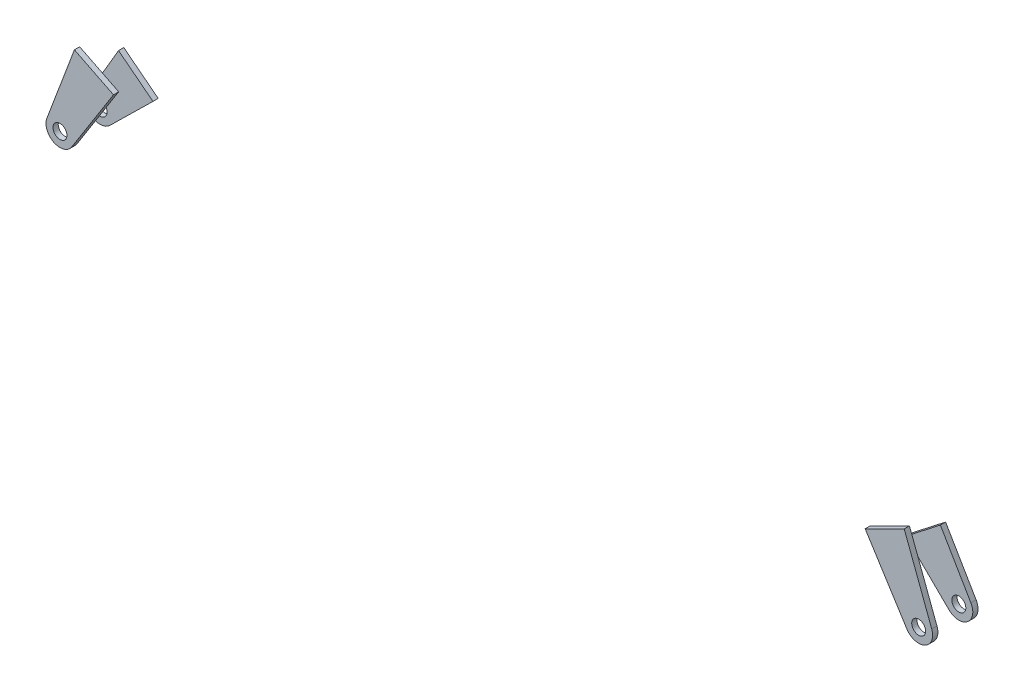
ISO-10303-21;
HEADER;
FILE_DESCRIPTION(('STEP AP214'),'2;1');
FILE_NAME('part.step','',(''),(''),'','','');
FILE_SCHEMA(('AUTOMOTIVE_DESIGN { 1 0 10303 214 1 1 1 1 }'));
ENDSEC;
DATA;
#1=APPLICATION_CONTEXT('core data for automotive mechanical design processes');
#2=APPLICATION_PROTOCOL_DEFINITION('international standard','automotive_design',2000,#1);
#3=PRODUCT_CONTEXT('',#1,'mechanical');
#4=PRODUCT('Part','Part','',(#3));
#5=PRODUCT_RELATED_PRODUCT_CATEGORY('part','',(#4));
#6=PRODUCT_DEFINITION_FORMATION('','',#4);
#7=PRODUCT_DEFINITION_CONTEXT('part definition',#1,'design');
#8=PRODUCT_DEFINITION('design','',#6,#7);
#9=PRODUCT_DEFINITION_SHAPE('','',#8);
#10=(LENGTH_UNIT() NAMED_UNIT(*) SI_UNIT(.MILLI.,.METRE.));
#11=(NAMED_UNIT(*) PLANE_ANGLE_UNIT() SI_UNIT($,.RADIAN.));
#12=(NAMED_UNIT(*) SI_UNIT($,.STERADIAN.) SOLID_ANGLE_UNIT());
#13=UNCERTAINTY_MEASURE_WITH_UNIT(LENGTH_MEASURE(1.E-05),#10,'distance_accuracy_value','');
#14=(GEOMETRIC_REPRESENTATION_CONTEXT(3) GLOBAL_UNCERTAINTY_ASSIGNED_CONTEXT((#13)) GLOBAL_UNIT_ASSIGNED_CONTEXT((#10,
#11,#12)) REPRESENTATION_CONTEXT('',''));
#15=CARTESIAN_POINT('',(0.,0.,0.));
#16=DIRECTION('',(0.,0.,1.));
#17=DIRECTION('',(1.,0.,0.));
#18=AXIS2_PLACEMENT_3D('',#15,#16,#17);
#19=CARTESIAN_POINT('',(-4.43336810765534E-12,-4.32523717820034E-12,209.000000000046));
#20=DIRECTION('',(0.,0.,1.));
#21=DIRECTION('',(-1.,0.,0.));
#22=AXIS2_PLACEMENT_3D('',#19,#20,#21);
#23=PLANE('',#22);
#24=DIRECTION('',(-0.505095261869612,-0.863063599300114,0.));
#25=VECTOR('',#24,1.);
#26=CARTESIAN_POINT('',(-235.431093867266,-2167.10216040395,208.999999999997));
#27=LINE('',#26,#25);
#28=CARTESIAN_POINT('',(-235.431093867266,-2167.10216040395,208.999999999997));
#29=VERTEX_POINT('',#28);
#30=CARTESIAN_POINT('',(-252.904508794401,-2196.95923790504,208.999999999996));
#31=VERTEX_POINT('',#30);
#32=EDGE_CURVE('E147',#29,#31,#27,.T.);
#33=ORIENTED_EDGE('',*,*,#32,.F.);
#34=DIRECTION('',(-0.788773223666959,0.614684310541625,0.));
#35=VECTOR('',#34,1.);
#36=CARTESIAN_POINT('',(-215.711763275593,-2182.46926816749,208.999999999997));
#37=LINE('',#36,#35);
#38=CARTESIAN_POINT('',(-215.711763275593,-2182.46926816749,208.999999999997));
#39=VERTEX_POINT('',#38);
#40=EDGE_CURVE('E182',#39,#29,#37,.T.);
#41=ORIENTED_EDGE('',*,*,#40,.F.);
#42=DIRECTION('',(0.713498668884314,0.700656584569297,0.));
#43=VECTOR('',#42,1.);
#44=CARTESIAN_POINT('',(-240.394747323446,-2206.70798935107,208.999999999996));
#45=LINE('',#44,#43);
#46=CARTESIAN_POINT('',(-240.394747323446,-2206.70798935107,208.999999999996));
#47=VERTEX_POINT('',#46);
#48=EDGE_CURVE('E190',#47,#39,#45,.T.);
#49=ORIENTED_EDGE('',*,*,#48,.F.);
#50=CARTESIAN_POINT('',(-246.,-2201.,208.999999999996));
#51=DIRECTION('',(0.,0.,1.));
#52=DIRECTION('',(0.,-1.,0.));
#53=AXIS2_PLACEMENT_3D('',#50,#51,#52);
#54=CIRCLE('',#53,7.99999999999981);
#55=EDGE_CURVE('E213',#31,#47,#54,.T.);
#56=ORIENTED_EDGE('',*,*,#55,.F.);
#57=EDGE_LOOP('',(#33,#41,#49,#56));
#58=FACE_BOUND('',#57,.T.);
#59=CARTESIAN_POINT('',(-246.,-2201.,208.999999999998));
#60=DIRECTION('',(0.,0.,-1.));
#61=DIRECTION('',(-1.,0.,0.));
#62=AXIS2_PLACEMENT_3D('',#59,#60,#61);
#63=CIRCLE('',#62,3.99999999999997);
#64=CARTESIAN_POINT('',(-250.,-2201.,208.999999999998));
#65=VERTEX_POINT('',#64);
#66=EDGE_CURVE('E198',#65,#65,#63,.T.);
#67=ORIENTED_EDGE('',*,*,#66,.F.);
#68=EDGE_LOOP('',(#67));
#69=FACE_BOUND('',#68,.T.);
#70=ADVANCED_FACE('F138',(#58,#69),#23,.F.);
#71=CARTESIAN_POINT('',(-4.43336810765534E-12,-4.32523717820034E-12,212.000000000046));
#72=DIRECTION('',(0.,0.,1.));
#73=DIRECTION('',(-1.,0.,0.));
#74=AXIS2_PLACEMENT_3D('',#71,#72,#73);
#75=PLANE('',#74);
#76=DIRECTION('',(-0.505095261869612,-0.863063599300114,0.));
#77=VECTOR('',#76,1.);
#78=CARTESIAN_POINT('',(-235.431093867266,-2167.10216040395,211.999999999997));
#79=LINE('',#78,#77);
#80=CARTESIAN_POINT('',(-235.431093867266,-2167.10216040395,211.999999999997));
#81=VERTEX_POINT('',#80);
#82=CARTESIAN_POINT('',(-252.904508794401,-2196.95923790504,211.999999999996));
#83=VERTEX_POINT('',#82);
#84=EDGE_CURVE('E13',#81,#83,#79,.T.);
#85=ORIENTED_EDGE('',*,*,#84,.T.);
#86=CARTESIAN_POINT('',(-246.,-2201.,211.999999999996));
#87=DIRECTION('',(0.,0.,1.));
#88=DIRECTION('',(0.,-1.,0.));
#89=AXIS2_PLACEMENT_3D('',#86,#87,#88);
#90=CIRCLE('',#89,7.99999999999981);
#91=CARTESIAN_POINT('',(-240.394747323446,-2206.70798935107,211.999999999996));
#92=VERTEX_POINT('',#91);
#93=EDGE_CURVE('E210',#83,#92,#90,.T.);
#94=ORIENTED_EDGE('',*,*,#93,.T.);
#95=DIRECTION('',(0.713498668884314,0.700656584569297,0.));
#96=VECTOR('',#95,1.);
#97=CARTESIAN_POINT('',(-240.394747323446,-2206.70798935107,211.999999999996));
#98=LINE('',#97,#96);
#99=CARTESIAN_POINT('',(-215.711763275593,-2182.46926816749,211.999999999997));
#100=VERTEX_POINT('',#99);
#101=EDGE_CURVE('E215',#92,#100,#98,.T.);
#102=ORIENTED_EDGE('',*,*,#101,.T.);
#103=DIRECTION('',(-0.788773223666959,0.614684310541625,0.));
#104=VECTOR('',#103,1.);
#105=CARTESIAN_POINT('',(-215.711763275593,-2182.46926816749,211.999999999997));
#106=LINE('',#105,#104);
#107=EDGE_CURVE('E185',#100,#81,#106,.T.);
#108=ORIENTED_EDGE('',*,*,#107,.T.);
#109=EDGE_LOOP('',(#85,#94,#102,#108));
#110=FACE_BOUND('',#109,.T.);
#111=CARTESIAN_POINT('',(-246.,-2201.,211.999999999998));
#112=DIRECTION('',(0.,0.,-1.));
#113=DIRECTION('',(-1.,0.,0.));
#114=AXIS2_PLACEMENT_3D('',#111,#112,#113);
#115=CIRCLE('',#114,3.99999999999997);
#116=CARTESIAN_POINT('',(-250.,-2201.,211.999999999998));
#117=VERTEX_POINT('',#116);
#118=EDGE_CURVE('E201',#117,#117,#115,.T.);
#119=ORIENTED_EDGE('',*,*,#118,.T.);
#120=EDGE_LOOP('',(#119));
#121=FACE_BOUND('',#120,.T.);
#122=ADVANCED_FACE('F227',(#110,#121),#75,.T.);
#123=CARTESIAN_POINT('',(-215.711763275593,-2182.46926816749,211.999999999997));
#124=DIRECTION('',(0.614684310541626,0.788773223666959,0.));
#125=DIRECTION('',(0.788773223666959,-0.614684310541626,0.));
#126=AXIS2_PLACEMENT_3D('',#123,#124,#125);
#127=PLANE('',#126);
#128=ORIENTED_EDGE('',*,*,#40,.T.);
#129=DIRECTION('',(0.,0.,-1.));
#130=VECTOR('',#129,1.);
#131=CARTESIAN_POINT('',(-235.431093867266,-2167.10216040395,211.999999999997));
#132=LINE('',#131,#130);
#133=EDGE_CURVE('E173',#81,#29,#132,.T.);
#134=ORIENTED_EDGE('',*,*,#133,.F.);
#135=ORIENTED_EDGE('',*,*,#107,.F.);
#136=DIRECTION('',(0.,0.,-1.));
#137=VECTOR('',#136,1.);
#138=CARTESIAN_POINT('',(-215.711763275593,-2182.46926816749,211.999999999997));
#139=LINE('',#138,#137);
#140=EDGE_CURVE('E178',#100,#39,#139,.T.);
#141=ORIENTED_EDGE('',*,*,#140,.T.);
#142=EDGE_LOOP('',(#128,#134,#135,#141));
#143=FACE_BOUND('',#142,.T.);
#144=ADVANCED_FACE('F180',(#143),#127,.T.);
#145=CARTESIAN_POINT('',(-240.394747323446,-2206.70798935107,211.999999999996));
#146=DIRECTION('',(0.700656584569297,-0.713498668884314,0.));
#147=DIRECTION('',(-0.713498668884314,-0.700656584569297,0.));
#148=AXIS2_PLACEMENT_3D('',#145,#146,#147);
#149=PLANE('',#148);
#150=ORIENTED_EDGE('',*,*,#48,.T.);
#151=ORIENTED_EDGE('',*,*,#140,.F.);
#152=ORIENTED_EDGE('',*,*,#101,.F.);
#153=DIRECTION('',(0.,0.,-1.));
#154=VECTOR('',#153,1.);
#155=CARTESIAN_POINT('',(-240.394747323446,-2206.70798935107,211.999999999996));
#156=LINE('',#155,#154);
#157=EDGE_CURVE('E192',#92,#47,#156,.T.);
#158=ORIENTED_EDGE('',*,*,#157,.T.);
#159=EDGE_LOOP('',(#150,#151,#152,#158));
#160=FACE_BOUND('',#159,.T.);
#161=ADVANCED_FACE('F191',(#160),#149,.T.);
#162=CARTESIAN_POINT('',(-246.,-2201.,211.999999999996));
#163=DIRECTION('',(0.,0.,-1.));
#164=DIRECTION('',(1.,0.,0.));
#165=AXIS2_PLACEMENT_3D('',#162,#163,#164);
#166=CYLINDRICAL_SURFACE('',#165,7.99999999999981);
#167=ORIENTED_EDGE('',*,*,#55,.T.);
#168=ORIENTED_EDGE('',*,*,#157,.F.);
#169=ORIENTED_EDGE('',*,*,#93,.F.);
#170=DIRECTION('',(0.,0.,-1.));
#171=VECTOR('',#170,1.);
#172=CARTESIAN_POINT('',(-252.904508794401,-2196.95923790504,211.999999999996));
#173=LINE('',#172,#171);
#174=EDGE_CURVE('E156',#83,#31,#173,.T.);
#175=ORIENTED_EDGE('',*,*,#174,.T.);
#176=EDGE_LOOP('',(#167,#168,#169,#175));
#177=FACE_BOUND('',#176,.T.);
#178=ADVANCED_FACE('F262',(#177),#166,.T.);
#179=CARTESIAN_POINT('',(-235.431093867266,-2167.10216040395,211.999999999997));
#180=DIRECTION('',(-0.863063599300114,0.505095261869612,0.));
#181=DIRECTION('',(0.505095261869612,0.863063599300114,0.));
#182=AXIS2_PLACEMENT_3D('',#179,#180,#181);
#183=PLANE('',#182);
#184=ORIENTED_EDGE('',*,*,#32,.T.);
#185=ORIENTED_EDGE('',*,*,#174,.F.);
#186=ORIENTED_EDGE('',*,*,#84,.F.);
#187=ORIENTED_EDGE('',*,*,#133,.T.);
#188=EDGE_LOOP('',(#184,#185,#186,#187));
#189=FACE_BOUND('',#188,.T.);
#190=ADVANCED_FACE('F248',(#189),#183,.T.);
#191=CARTESIAN_POINT('',(-246.,-2201.,211.999999999998));
#192=DIRECTION('',(0.,0.,-1.));
#193=DIRECTION('',(1.,0.,0.));
#194=AXIS2_PLACEMENT_3D('',#191,#192,#193);
#195=CYLINDRICAL_SURFACE('',#194,3.99999999999997);
#196=ORIENTED_EDGE('',*,*,#118,.F.);
#197=EDGE_LOOP('',(#196));
#198=FACE_BOUND('',#197,.T.);
#199=ORIENTED_EDGE('',*,*,#66,.T.);
#200=EDGE_LOOP('',(#199));
#201=FACE_BOUND('',#200,.T.);
#202=ADVANCED_FACE('F245',(#198,#201),#195,.F.);
#203=CLOSED_SHELL('',(#70,#122,#144,#161,#178,#190,#202));
#204=MANIFOLD_SOLID_BREP('B2',#203);
#205=CARTESIAN_POINT('',(4.85129201260788E-13,-4.85129201260787E-13,235.000000000002));
#206=DIRECTION('',(0.,0.,1.));
#207=DIRECTION('',(-1.,0.,0.));
#208=AXIS2_PLACEMENT_3D('',#205,#206,#207);
#209=PLANE('',#208);
#210=CARTESIAN_POINT('',(-246.,-2201.,234.999999999998));
#211=DIRECTION('',(0.,0.,-1.));
#212=DIRECTION('',(-1.,0.,0.));
#213=AXIS2_PLACEMENT_3D('',#210,#211,#212);
#214=CIRCLE('',#213,3.99999999999997);
#215=CARTESIAN_POINT('',(-250.,-2201.,234.999999999998));
#216=VERTEX_POINT('',#215);
#217=EDGE_CURVE('E394',#216,#216,#214,.T.);
#218=ORIENTED_EDGE('',*,*,#217,.T.);
#219=EDGE_LOOP('',(#218));
#220=FACE_BOUND('',#219,.T.);
#221=DIRECTION('',(-0.894971907928114,0.446122498894094,0.));
#222=VECTOR('',#221,1.);
#223=CARTESIAN_POINT('',(-215.336660674709,-2167.50510266475,234.999999999998));
#224=LINE('',#223,#222);
#225=CARTESIAN_POINT('',(-215.336660674709,-2167.50510266475,234.999999999998));
#226=VERTEX_POINT('',#225);
#227=CARTESIAN_POINT('',(-237.710958372912,-2156.3520401924,234.999999999998));
#228=VERTEX_POINT('',#227);
#229=EDGE_CURVE('E326',#226,#228,#224,.T.);
#230=ORIENTED_EDGE('',*,*,#229,.T.);
#231=DIRECTION('',(-0.352888871196621,-0.935665241732092,0.));
#232=VECTOR('',#231,1.);
#233=CARTESIAN_POINT('',(-237.710958372912,-2156.3520401924,234.999999999998));
#234=LINE('',#233,#232);
#235=CARTESIAN_POINT('',(-253.485321933857,-2198.17688903043,234.999999999998));
#236=VERTEX_POINT('',#235);
#237=EDGE_CURVE('E371',#228,#236,#234,.T.);
#238=ORIENTED_EDGE('',*,*,#237,.T.);
#239=CARTESIAN_POINT('',(-246.,-2201.,234.999999999998));
#240=DIRECTION('',(0.,0.,-1.));
#241=DIRECTION('',(-1.,0.,0.));
#242=AXIS2_PLACEMENT_3D('',#239,#240,#241);
#243=CIRCLE('',#242,7.99999999999976);
#244=CARTESIAN_POINT('',(-239.239864031659,-2205.27791557765,234.999999999998));
#245=VERTEX_POINT('',#244);
#246=EDGE_CURVE('E369',#245,#236,#243,.T.);
#247=ORIENTED_EDGE('',*,*,#246,.F.);
#248=DIRECTION('',(0.5347394472067,0.845016996042726,0.));
#249=VECTOR('',#248,1.);
#250=CARTESIAN_POINT('',(-239.239864031659,-2205.27791557765,234.999999999998));
#251=LINE('',#250,#249);
#252=EDGE_CURVE('E392',#245,#226,#251,.T.);
#253=ORIENTED_EDGE('',*,*,#252,.T.);
#254=EDGE_LOOP('',(#230,#238,#247,#253));
#255=FACE_BOUND('',#254,.T.);
#256=ADVANCED_FACE('F317',(#220,#255),#209,.T.);
#257=CARTESIAN_POINT('',(4.85129201260788E-13,-4.85129201260787E-13,232.000000000002));
#258=DIRECTION('',(0.,0.,1.));
#259=DIRECTION('',(-1.,0.,0.));
#260=AXIS2_PLACEMENT_3D('',#257,#258,#259);
#261=PLANE('',#260);
#262=CARTESIAN_POINT('',(-246.,-2201.,231.999999999998));
#263=DIRECTION('',(0.,0.,-1.));
#264=DIRECTION('',(-1.,0.,0.));
#265=AXIS2_PLACEMENT_3D('',#262,#263,#264);
#266=CIRCLE('',#265,3.99999999999997);
#267=CARTESIAN_POINT('',(-250.,-2201.,231.999999999998));
#268=VERTEX_POINT('',#267);
#269=EDGE_CURVE('E399',#268,#268,#266,.T.);
#270=ORIENTED_EDGE('',*,*,#269,.F.);
#271=EDGE_LOOP('',(#270));
#272=FACE_BOUND('',#271,.T.);
#273=DIRECTION('',(-0.894971907928114,0.446122498894094,0.));
#274=VECTOR('',#273,1.);
#275=CARTESIAN_POINT('',(-215.336660674709,-2167.50510266475,231.999999999998));
#276=LINE('',#275,#274);
#277=CARTESIAN_POINT('',(-215.336660674709,-2167.50510266475,231.999999999998));
#278=VERTEX_POINT('',#277);
#279=CARTESIAN_POINT('',(-237.710958372912,-2156.3520401924,231.999999999998));
#280=VERTEX_POINT('',#279);
#281=EDGE_CURVE('E136',#278,#280,#276,.T.);
#282=ORIENTED_EDGE('',*,*,#281,.F.);
#283=DIRECTION('',(0.5347394472067,0.845016996042726,0.));
#284=VECTOR('',#283,1.);
#285=CARTESIAN_POINT('',(-239.239864031659,-2205.27791557765,231.999999999998));
#286=LINE('',#285,#284);
#287=CARTESIAN_POINT('',(-239.239864031659,-2205.27791557765,231.999999999998));
#288=VERTEX_POINT('',#287);
#289=EDGE_CURVE('E380',#288,#278,#286,.T.);
#290=ORIENTED_EDGE('',*,*,#289,.F.);
#291=CARTESIAN_POINT('',(-246.,-2201.,231.999999999998));
#292=DIRECTION('',(0.,0.,-1.));
#293=DIRECTION('',(-1.,0.,0.));
#294=AXIS2_PLACEMENT_3D('',#291,#292,#293);
#295=CIRCLE('',#294,7.99999999999976);
#296=CARTESIAN_POINT('',(-253.485321933857,-2198.17688903043,231.999999999998));
#297=VERTEX_POINT('',#296);
#298=EDGE_CURVE('E366',#288,#297,#295,.T.);
#299=ORIENTED_EDGE('',*,*,#298,.T.);
#300=DIRECTION('',(-0.352888871196621,-0.935665241732092,0.));
#301=VECTOR('',#300,1.);
#302=CARTESIAN_POINT('',(-237.710958372912,-2156.3520401924,231.999999999998));
#303=LINE('',#302,#301);
#304=EDGE_CURVE('E374',#280,#297,#303,.T.);
#305=ORIENTED_EDGE('',*,*,#304,.F.);
#306=EDGE_LOOP('',(#282,#290,#299,#305));
#307=FACE_BOUND('',#306,.T.);
#308=ADVANCED_FACE('F379',(#272,#307),#261,.F.);
#309=CARTESIAN_POINT('',(-239.239864031659,-2205.27791557765,231.999999999998));
#310=DIRECTION('',(-0.845016996042726,0.5347394472067,0.));
#311=DIRECTION('',(0.5347394472067,0.845016996042726,0.));
#312=AXIS2_PLACEMENT_3D('',#309,#310,#311);
#313=PLANE('',#312);
#314=ORIENTED_EDGE('',*,*,#252,.F.);
#315=DIRECTION('',(0.,0.,1.));
#316=VECTOR('',#315,1.);
#317=CARTESIAN_POINT('',(-239.239864031659,-2205.27791557765,231.999999999998));
#318=LINE('',#317,#316);
#319=EDGE_CURVE('E353',#288,#245,#318,.T.);
#320=ORIENTED_EDGE('',*,*,#319,.F.);
#321=ORIENTED_EDGE('',*,*,#289,.T.);
#322=DIRECTION('',(0.,0.,1.));
#323=VECTOR('',#322,1.);
#324=CARTESIAN_POINT('',(-215.336660674709,-2167.50510266475,231.999999999998));
#325=LINE('',#324,#323);
#326=EDGE_CURVE('E334',#278,#226,#325,.T.);
#327=ORIENTED_EDGE('',*,*,#326,.T.);
#328=EDGE_LOOP('',(#314,#320,#321,#327));
#329=FACE_BOUND('',#328,.T.);
#330=ADVANCED_FACE('F426',(#329),#313,.F.);
#331=CARTESIAN_POINT('',(-237.710958372912,-2156.3520401924,231.999999999998));
#332=DIRECTION('',(0.935665241732092,-0.352888871196621,0.));
#333=DIRECTION('',(-0.352888871196621,-0.935665241732092,0.));
#334=AXIS2_PLACEMENT_3D('',#331,#332,#333);
#335=PLANE('',#334);
#336=ORIENTED_EDGE('',*,*,#237,.F.);
#337=DIRECTION('',(0.,0.,1.));
#338=VECTOR('',#337,1.);
#339=CARTESIAN_POINT('',(-237.710958372912,-2156.3520401924,231.999999999998));
#340=LINE('',#339,#338);
#341=EDGE_CURVE('E363',#280,#228,#340,.T.);
#342=ORIENTED_EDGE('',*,*,#341,.F.);
#343=ORIENTED_EDGE('',*,*,#304,.T.);
#344=DIRECTION('',(0.,0.,1.));
#345=VECTOR('',#344,1.);
#346=CARTESIAN_POINT('',(-253.485321933857,-2198.17688903043,231.999999999998));
#347=LINE('',#346,#345);
#348=EDGE_CURVE('E360',#297,#236,#347,.T.);
#349=ORIENTED_EDGE('',*,*,#348,.T.);
#350=EDGE_LOOP('',(#336,#342,#343,#349));
#351=FACE_BOUND('',#350,.T.);
#352=ADVANCED_FACE('F375',(#351),#335,.F.);
#353=CARTESIAN_POINT('',(-215.336660674709,-2167.50510266475,231.999999999998));
#354=DIRECTION('',(-0.446122498894094,-0.894971907928114,0.));
#355=DIRECTION('',(-0.894971907928114,0.446122498894094,0.));
#356=AXIS2_PLACEMENT_3D('',#353,#354,#355);
#357=PLANE('',#356);
#358=ORIENTED_EDGE('',*,*,#229,.F.);
#359=ORIENTED_EDGE('',*,*,#326,.F.);
#360=ORIENTED_EDGE('',*,*,#281,.T.);
#361=ORIENTED_EDGE('',*,*,#341,.T.);
#362=EDGE_LOOP('',(#358,#359,#360,#361));
#363=FACE_BOUND('',#362,.T.);
#364=ADVANCED_FACE('F434',(#363),#357,.F.);
#365=CARTESIAN_POINT('',(-246.,-2201.,231.999999999998));
#366=DIRECTION('',(0.,0.,1.));
#367=DIRECTION('',(-1.,0.,0.));
#368=AXIS2_PLACEMENT_3D('',#365,#366,#367);
#369=CYLINDRICAL_SURFACE('',#368,7.99999999999976);
#370=ORIENTED_EDGE('',*,*,#246,.T.);
#371=ORIENTED_EDGE('',*,*,#348,.F.);
#372=ORIENTED_EDGE('',*,*,#298,.F.);
#373=ORIENTED_EDGE('',*,*,#319,.T.);
#374=EDGE_LOOP('',(#370,#371,#372,#373));
#375=FACE_BOUND('',#374,.T.);
#376=ADVANCED_FACE('F364',(#375),#369,.T.);
#377=CARTESIAN_POINT('',(-246.,-2201.,231.999999999998));
#378=DIRECTION('',(0.,0.,1.));
#379=DIRECTION('',(-1.,0.,0.));
#380=AXIS2_PLACEMENT_3D('',#377,#378,#379);
#381=CYLINDRICAL_SURFACE('',#380,3.99999999999997);
#382=ORIENTED_EDGE('',*,*,#269,.T.);
#383=EDGE_LOOP('',(#382));
#384=FACE_BOUND('',#383,.T.);
#385=ORIENTED_EDGE('',*,*,#217,.F.);
#386=EDGE_LOOP('',(#385));
#387=FACE_BOUND('',#386,.T.);
#388=ADVANCED_FACE('F422',(#384,#387),#381,.F.);
#389=CLOSED_SHELL('',(#256,#308,#330,#352,#364,#376,#388));
#390=MANIFOLD_SOLID_BREP('B7',#389);
#391=CARTESIAN_POINT('',(4.43336810765534E-12,-4.32523717820034E-12,209.000000000046));
#392=DIRECTION('',(0.,0.,1.));
#393=DIRECTION('',(1.,0.,0.));
#394=AXIS2_PLACEMENT_3D('',#391,#392,#393);
#395=PLANE('',#394);
#396=DIRECTION('',(0.505095261869612,-0.863063599300114,0.));
#397=VECTOR('',#396,1.);
#398=CARTESIAN_POINT('',(235.431093867266,-2167.10216040395,208.999999999997));
#399=LINE('',#398,#397);
#400=CARTESIAN_POINT('',(235.431093867266,-2167.10216040395,208.999999999997));
#401=VERTEX_POINT('',#400);
#402=CARTESIAN_POINT('',(252.904508794401,-2196.95923790504,208.999999999996));
#403=VERTEX_POINT('',#402);
#404=EDGE_CURVE('E504',#401,#403,#399,.T.);
#405=ORIENTED_EDGE('',*,*,#404,.T.);
#406=CARTESIAN_POINT('',(246.,-2201.,208.999999999996));
#407=DIRECTION('',(0.,0.,-1.));
#408=DIRECTION('',(0.,-1.,0.));
#409=AXIS2_PLACEMENT_3D('',#406,#407,#408);
#410=CIRCLE('',#409,7.99999999999981);
#411=CARTESIAN_POINT('',(240.394747323446,-2206.70798935107,208.999999999996));
#412=VERTEX_POINT('',#411);
#413=EDGE_CURVE('E539',#403,#412,#410,.T.);
#414=ORIENTED_EDGE('',*,*,#413,.T.);
#415=DIRECTION('',(-0.713498668884314,0.700656584569297,0.));
#416=VECTOR('',#415,1.);
#417=CARTESIAN_POINT('',(240.394747323446,-2206.70798935107,208.999999999996));
#418=LINE('',#417,#416);
#419=CARTESIAN_POINT('',(215.711763275593,-2182.46926816749,208.999999999997));
#420=VERTEX_POINT('',#419);
#421=EDGE_CURVE('E535',#412,#420,#418,.T.);
#422=ORIENTED_EDGE('',*,*,#421,.T.);
#423=DIRECTION('',(0.788773223666959,0.614684310541625,0.));
#424=VECTOR('',#423,1.);
#425=CARTESIAN_POINT('',(215.711763275593,-2182.46926816749,208.999999999997));
#426=LINE('',#425,#424);
#427=EDGE_CURVE('E532',#420,#401,#426,.T.);
#428=ORIENTED_EDGE('',*,*,#427,.T.);
#429=EDGE_LOOP('',(#405,#414,#422,#428));
#430=FACE_BOUND('',#429,.T.);
#431=CARTESIAN_POINT('',(246.,-2201.,208.999999999998));
#432=DIRECTION('',(0.,0.,1.));
#433=DIRECTION('',(1.,0.,0.));
#434=AXIS2_PLACEMENT_3D('',#431,#432,#433);
#435=CIRCLE('',#434,3.99999999999997);
#436=CARTESIAN_POINT('',(250.,-2201.,208.999999999998));
#437=VERTEX_POINT('',#436);
#438=EDGE_CURVE('E557',#437,#437,#435,.T.);
#439=ORIENTED_EDGE('',*,*,#438,.T.);
#440=EDGE_LOOP('',(#439));
#441=FACE_BOUND('',#440,.T.);
#442=ADVANCED_FACE('F495',(#430,#441),#395,.F.);
#443=CARTESIAN_POINT('',(4.43336810765534E-12,-4.32523717820034E-12,212.000000000046));
#444=DIRECTION('',(0.,0.,1.));
#445=DIRECTION('',(1.,0.,0.));
#446=AXIS2_PLACEMENT_3D('',#443,#444,#445);
#447=PLANE('',#446);
#448=DIRECTION('',(0.505095261869612,-0.863063599300114,0.));
#449=VECTOR('',#448,1.);
#450=CARTESIAN_POINT('',(235.431093867266,-2167.10216040395,211.999999999997));
#451=LINE('',#450,#449);
#452=CARTESIAN_POINT('',(235.431093867266,-2167.10216040395,211.999999999997));
#453=VERTEX_POINT('',#452);
#454=CARTESIAN_POINT('',(252.904508794401,-2196.95923790504,211.999999999996));
#455=VERTEX_POINT('',#454);
#456=EDGE_CURVE('E315',#453,#455,#451,.T.);
#457=ORIENTED_EDGE('',*,*,#456,.F.);
#458=DIRECTION('',(0.788773223666959,0.614684310541625,0.));
#459=VECTOR('',#458,1.);
#460=CARTESIAN_POINT('',(215.711763275593,-2182.46926816749,211.999999999997));
#461=LINE('',#460,#459);
#462=CARTESIAN_POINT('',(215.711763275593,-2182.46926816749,211.999999999997));
#463=VERTEX_POINT('',#462);
#464=EDGE_CURVE('E553',#463,#453,#461,.T.);
#465=ORIENTED_EDGE('',*,*,#464,.F.);
#466=DIRECTION('',(-0.713498668884314,0.700656584569297,0.));
#467=VECTOR('',#466,1.);
#468=CARTESIAN_POINT('',(240.394747323446,-2206.70798935107,211.999999999996));
#469=LINE('',#468,#467);
#470=CARTESIAN_POINT('',(240.394747323446,-2206.70798935107,211.999999999996));
#471=VERTEX_POINT('',#470);
#472=EDGE_CURVE('E550',#471,#463,#469,.T.);
#473=ORIENTED_EDGE('',*,*,#472,.F.);
#474=CARTESIAN_POINT('',(246.,-2201.,211.999999999996));
#475=DIRECTION('',(0.,0.,-1.));
#476=DIRECTION('',(0.,-1.,0.));
#477=AXIS2_PLACEMENT_3D('',#474,#475,#476);
#478=CIRCLE('',#477,7.99999999999981);
#479=EDGE_CURVE('E513',#455,#471,#478,.T.);
#480=ORIENTED_EDGE('',*,*,#479,.F.);
#481=EDGE_LOOP('',(#457,#465,#473,#480));
#482=FACE_BOUND('',#481,.T.);
#483=CARTESIAN_POINT('',(246.,-2201.,211.999999999998));
#484=DIRECTION('',(0.,0.,1.));
#485=DIRECTION('',(1.,0.,0.));
#486=AXIS2_PLACEMENT_3D('',#483,#484,#485);
#487=CIRCLE('',#486,3.99999999999997);
#488=CARTESIAN_POINT('',(250.,-2201.,211.999999999998));
#489=VERTEX_POINT('',#488);
#490=EDGE_CURVE('E560',#489,#489,#487,.T.);
#491=ORIENTED_EDGE('',*,*,#490,.F.);
#492=EDGE_LOOP('',(#491));
#493=FACE_BOUND('',#492,.T.);
#494=ADVANCED_FACE('F603',(#482,#493),#447,.T.);
#495=CARTESIAN_POINT('',(215.711763275593,-2182.46926816749,211.999999999997));
#496=DIRECTION('',(-0.614684310541626,0.788773223666959,0.));
#497=DIRECTION('',(-0.788773223666959,-0.614684310541626,0.));
#498=AXIS2_PLACEMENT_3D('',#495,#496,#497);
#499=PLANE('',#498);
#500=ORIENTED_EDGE('',*,*,#427,.F.);
#501=DIRECTION('',(0.,0.,-1.));
#502=VECTOR('',#501,1.);
#503=CARTESIAN_POINT('',(215.711763275593,-2182.46926816749,211.999999999997));
#504=LINE('',#503,#502);
#505=EDGE_CURVE('E548',#463,#420,#504,.T.);
#506=ORIENTED_EDGE('',*,*,#505,.F.);
#507=ORIENTED_EDGE('',*,*,#464,.T.);
#508=DIRECTION('',(0.,0.,-1.));
#509=VECTOR('',#508,1.);
#510=CARTESIAN_POINT('',(235.431093867266,-2167.10216040395,211.999999999997));
#511=LINE('',#510,#509);
#512=EDGE_CURVE('E544',#453,#401,#511,.T.);
#513=ORIENTED_EDGE('',*,*,#512,.T.);
#514=EDGE_LOOP('',(#500,#506,#507,#513));
#515=FACE_BOUND('',#514,.T.);
#516=ADVANCED_FACE('F554',(#515),#499,.T.);
#517=CARTESIAN_POINT('',(240.394747323446,-2206.70798935107,211.999999999996));
#518=DIRECTION('',(-0.700656584569297,-0.713498668884314,0.));
#519=DIRECTION('',(0.713498668884314,-0.700656584569297,0.));
#520=AXIS2_PLACEMENT_3D('',#517,#518,#519);
#521=PLANE('',#520);
#522=ORIENTED_EDGE('',*,*,#421,.F.);
#523=DIRECTION('',(0.,0.,-1.));
#524=VECTOR('',#523,1.);
#525=CARTESIAN_POINT('',(240.394747323446,-2206.70798935107,211.999999999996));
#526=LINE('',#525,#524);
#527=EDGE_CURVE('E543',#471,#412,#526,.T.);
#528=ORIENTED_EDGE('',*,*,#527,.F.);
#529=ORIENTED_EDGE('',*,*,#472,.T.);
#530=ORIENTED_EDGE('',*,*,#505,.T.);
#531=EDGE_LOOP('',(#522,#528,#529,#530));
#532=FACE_BOUND('',#531,.T.);
#533=ADVANCED_FACE('F549',(#532),#521,.T.);
#534=CARTESIAN_POINT('',(246.,-2201.,211.999999999996));
#535=DIRECTION('',(0.,0.,-1.));
#536=DIRECTION('',(-1.,0.,0.));
#537=AXIS2_PLACEMENT_3D('',#534,#535,#536);
#538=CYLINDRICAL_SURFACE('',#537,7.99999999999981);
#539=ORIENTED_EDGE('',*,*,#413,.F.);
#540=DIRECTION('',(0.,0.,-1.));
#541=VECTOR('',#540,1.);
#542=CARTESIAN_POINT('',(252.904508794401,-2196.95923790504,211.999999999996));
#543=LINE('',#542,#541);
#544=EDGE_CURVE('E572',#455,#403,#543,.T.);
#545=ORIENTED_EDGE('',*,*,#544,.F.);
#546=ORIENTED_EDGE('',*,*,#479,.T.);
#547=ORIENTED_EDGE('',*,*,#527,.T.);
#548=EDGE_LOOP('',(#539,#545,#546,#547));
#549=FACE_BOUND('',#548,.T.);
#550=ADVANCED_FACE('F583',(#549),#538,.T.);
#551=CARTESIAN_POINT('',(235.431093867266,-2167.10216040395,211.999999999997));
#552=DIRECTION('',(0.863063599300114,0.505095261869612,0.));
#553=DIRECTION('',(-0.505095261869612,0.863063599300114,0.));
#554=AXIS2_PLACEMENT_3D('',#551,#552,#553);
#555=PLANE('',#554);
#556=ORIENTED_EDGE('',*,*,#404,.F.);
#557=ORIENTED_EDGE('',*,*,#512,.F.);
#558=ORIENTED_EDGE('',*,*,#456,.T.);
#559=ORIENTED_EDGE('',*,*,#544,.T.);
#560=EDGE_LOOP('',(#556,#557,#558,#559));
#561=FACE_BOUND('',#560,.T.);
#562=ADVANCED_FACE('F605',(#561),#555,.T.);
#563=CARTESIAN_POINT('',(246.,-2201.,211.999999999998));
#564=DIRECTION('',(0.,0.,-1.));
#565=DIRECTION('',(-1.,0.,0.));
#566=AXIS2_PLACEMENT_3D('',#563,#564,#565);
#567=CYLINDRICAL_SURFACE('',#566,3.99999999999997);
#568=ORIENTED_EDGE('',*,*,#490,.T.);
#569=EDGE_LOOP('',(#568));
#570=FACE_BOUND('',#569,.T.);
#571=ORIENTED_EDGE('',*,*,#438,.F.);
#572=EDGE_LOOP('',(#571));
#573=FACE_BOUND('',#572,.T.);
#574=ADVANCED_FACE('F600',(#570,#573),#567,.F.);
#575=CLOSED_SHELL('',(#442,#494,#516,#533,#550,#562,#574));
#576=MANIFOLD_SOLID_BREP('B130',#575);
#577=CARTESIAN_POINT('',(-4.85129201260788E-13,-4.85129201260787E-13,235.000000000002));
#578=DIRECTION('',(0.,0.,1.));
#579=DIRECTION('',(1.,0.,0.));
#580=AXIS2_PLACEMENT_3D('',#577,#578,#579);
#581=PLANE('',#580);
#582=CARTESIAN_POINT('',(246.,-2201.,234.999999999998));
#583=DIRECTION('',(0.,0.,1.));
#584=DIRECTION('',(1.,0.,0.));
#585=AXIS2_PLACEMENT_3D('',#582,#583,#584);
#586=CIRCLE('',#585,3.99999999999997);
#587=CARTESIAN_POINT('',(250.,-2201.,234.999999999998));
#588=VERTEX_POINT('',#587);
#589=EDGE_CURVE('E737',#588,#588,#586,.T.);
#590=ORIENTED_EDGE('',*,*,#589,.F.);
#591=EDGE_LOOP('',(#590));
#592=FACE_BOUND('',#591,.T.);
#593=DIRECTION('',(0.894971907928114,0.446122498894094,0.));
#594=VECTOR('',#593,1.);
#595=CARTESIAN_POINT('',(215.336660674709,-2167.50510266475,234.999999999998));
#596=LINE('',#595,#594);
#597=CARTESIAN_POINT('',(215.336660674709,-2167.50510266475,234.999999999998));
#598=VERTEX_POINT('',#597);
#599=CARTESIAN_POINT('',(237.710958372912,-2156.3520401924,234.999999999998));
#600=VERTEX_POINT('',#599);
#601=EDGE_CURVE('E673',#598,#600,#596,.T.);
#602=ORIENTED_EDGE('',*,*,#601,.F.);
#603=DIRECTION('',(-0.5347394472067,0.845016996042726,0.));
#604=VECTOR('',#603,1.);
#605=CARTESIAN_POINT('',(239.239864031659,-2205.27791557765,234.999999999998));
#606=LINE('',#605,#604);
#607=CARTESIAN_POINT('',(239.239864031659,-2205.27791557765,234.999999999998));
#608=VERTEX_POINT('',#607);
#609=EDGE_CURVE('E694',#608,#598,#606,.T.);
#610=ORIENTED_EDGE('',*,*,#609,.F.);
#611=CARTESIAN_POINT('',(246.,-2201.,234.999999999998));
#612=DIRECTION('',(0.,0.,1.));
#613=DIRECTION('',(1.,0.,0.));
#614=AXIS2_PLACEMENT_3D('',#611,#612,#613);
#615=CIRCLE('',#614,7.99999999999976);
#616=CARTESIAN_POINT('',(253.485321933857,-2198.17688903043,234.999999999998));
#617=VERTEX_POINT('',#616);
#618=EDGE_CURVE('E702',#608,#617,#615,.T.);
#619=ORIENTED_EDGE('',*,*,#618,.T.);
#620=DIRECTION('',(0.352888871196621,-0.935665241732092,0.));
#621=VECTOR('',#620,1.);
#622=CARTESIAN_POINT('',(237.710958372912,-2156.3520401924,234.999999999998));
#623=LINE('',#622,#621);
#624=EDGE_CURVE('E709',#600,#617,#623,.T.);
#625=ORIENTED_EDGE('',*,*,#624,.F.);
#626=EDGE_LOOP('',(#602,#610,#619,#625));
#627=FACE_BOUND('',#626,.T.);
#628=ADVANCED_FACE('F664',(#592,#627),#581,.T.);
#629=CARTESIAN_POINT('',(-4.85129201260788E-13,-4.85129201260787E-13,232.000000000002));
#630=DIRECTION('',(0.,0.,1.));
#631=DIRECTION('',(1.,0.,0.));
#632=AXIS2_PLACEMENT_3D('',#629,#630,#631);
#633=PLANE('',#632);
#634=CARTESIAN_POINT('',(246.,-2201.,231.999999999998));
#635=DIRECTION('',(0.,0.,1.));
#636=DIRECTION('',(1.,0.,0.));
#637=AXIS2_PLACEMENT_3D('',#634,#635,#636);
#638=CIRCLE('',#637,3.99999999999997);
#639=CARTESIAN_POINT('',(250.,-2201.,231.999999999998));
#640=VERTEX_POINT('',#639);
#641=EDGE_CURVE('E764',#640,#640,#638,.T.);
#642=ORIENTED_EDGE('',*,*,#641,.T.);
#643=EDGE_LOOP('',(#642));
#644=FACE_BOUND('',#643,.T.);
#645=DIRECTION('',(0.894971907928114,0.446122498894094,0.));
#646=VECTOR('',#645,1.);
#647=CARTESIAN_POINT('',(215.336660674709,-2167.50510266475,231.999999999998));
#648=LINE('',#647,#646);
#649=CARTESIAN_POINT('',(215.336660674709,-2167.50510266475,231.999999999998));
#650=VERTEX_POINT('',#649);
#651=CARTESIAN_POINT('',(237.710958372912,-2156.3520401924,231.999999999998));
#652=VERTEX_POINT('',#651);
#653=EDGE_CURVE('E493',#650,#652,#648,.T.);
#654=ORIENTED_EDGE('',*,*,#653,.T.);
#655=DIRECTION('',(0.352888871196621,-0.935665241732092,0.));
#656=VECTOR('',#655,1.);
#657=CARTESIAN_POINT('',(237.710958372912,-2156.3520401924,231.999999999998));
#658=LINE('',#657,#656);
#659=CARTESIAN_POINT('',(253.485321933857,-2198.17688903043,231.999999999998));
#660=VERTEX_POINT('',#659);
#661=EDGE_CURVE('E724',#652,#660,#658,.T.);
#662=ORIENTED_EDGE('',*,*,#661,.T.);
#663=CARTESIAN_POINT('',(246.,-2201.,231.999999999998));
#664=DIRECTION('',(0.,0.,1.));
#665=DIRECTION('',(1.,0.,0.));
#666=AXIS2_PLACEMENT_3D('',#663,#664,#665);
#667=CIRCLE('',#666,7.99999999999976);
#668=CARTESIAN_POINT('',(239.239864031659,-2205.27791557765,231.999999999998));
#669=VERTEX_POINT('',#668);
#670=EDGE_CURVE('E715',#669,#660,#667,.T.);
#671=ORIENTED_EDGE('',*,*,#670,.F.);
#672=DIRECTION('',(-0.5347394472067,0.845016996042726,0.));
#673=VECTOR('',#672,1.);
#674=CARTESIAN_POINT('',(239.239864031659,-2205.27791557765,231.999999999998));
#675=LINE('',#674,#673);
#676=EDGE_CURVE('E752',#669,#650,#675,.T.);
#677=ORIENTED_EDGE('',*,*,#676,.T.);
#678=EDGE_LOOP('',(#654,#662,#671,#677));
#679=FACE_BOUND('',#678,.T.);
#680=ADVANCED_FACE('F726',(#644,#679),#633,.F.);
#681=CARTESIAN_POINT('',(239.239864031659,-2205.27791557765,231.999999999998));
#682=DIRECTION('',(0.845016996042726,0.5347394472067,0.));
#683=DIRECTION('',(-0.5347394472067,0.845016996042726,0.));
#684=AXIS2_PLACEMENT_3D('',#681,#682,#683);
#685=PLANE('',#684);
#686=ORIENTED_EDGE('',*,*,#609,.T.);
#687=DIRECTION('',(0.,0.,1.));
#688=VECTOR('',#687,1.);
#689=CARTESIAN_POINT('',(215.336660674709,-2167.50510266475,231.999999999998));
#690=LINE('',#689,#688);
#691=EDGE_CURVE('E750',#650,#598,#690,.T.);
#692=ORIENTED_EDGE('',*,*,#691,.F.);
#693=ORIENTED_EDGE('',*,*,#676,.F.);
#694=DIRECTION('',(0.,0.,1.));
#695=VECTOR('',#694,1.);
#696=CARTESIAN_POINT('',(239.239864031659,-2205.27791557765,231.999999999998));
#697=LINE('',#696,#695);
#698=EDGE_CURVE('E718',#669,#608,#697,.T.);
#699=ORIENTED_EDGE('',*,*,#698,.T.);
#700=EDGE_LOOP('',(#686,#692,#693,#699));
#701=FACE_BOUND('',#700,.T.);
#702=ADVANCED_FACE('F780',(#701),#685,.F.);
#703=CARTESIAN_POINT('',(237.710958372912,-2156.3520401924,231.999999999998));
#704=DIRECTION('',(-0.935665241732092,-0.352888871196621,0.));
#705=DIRECTION('',(0.352888871196621,-0.935665241732092,0.));
#706=AXIS2_PLACEMENT_3D('',#703,#704,#705);
#707=PLANE('',#706);
#708=ORIENTED_EDGE('',*,*,#624,.T.);
#709=DIRECTION('',(0.,0.,1.));
#710=VECTOR('',#709,1.);
#711=CARTESIAN_POINT('',(253.485321933857,-2198.17688903043,231.999999999998));
#712=LINE('',#711,#710);
#713=EDGE_CURVE('E717',#660,#617,#712,.T.);
#714=ORIENTED_EDGE('',*,*,#713,.F.);
#715=ORIENTED_EDGE('',*,*,#661,.F.);
#716=DIRECTION('',(0.,0.,1.));
#717=VECTOR('',#716,1.);
#718=CARTESIAN_POINT('',(237.710958372912,-2156.3520401924,231.999999999998));
#719=LINE('',#718,#717);
#720=EDGE_CURVE('E727',#652,#600,#719,.T.);
#721=ORIENTED_EDGE('',*,*,#720,.T.);
#722=EDGE_LOOP('',(#708,#714,#715,#721));
#723=FACE_BOUND('',#722,.T.);
#724=ADVANCED_FACE('F723',(#723),#707,.F.);
#725=CARTESIAN_POINT('',(215.336660674709,-2167.50510266475,231.999999999998));
#726=DIRECTION('',(0.446122498894094,-0.894971907928114,0.));
#727=DIRECTION('',(0.894971907928114,0.446122498894094,0.));
#728=AXIS2_PLACEMENT_3D('',#725,#726,#727);
#729=PLANE('',#728);
#730=ORIENTED_EDGE('',*,*,#601,.T.);
#731=ORIENTED_EDGE('',*,*,#720,.F.);
#732=ORIENTED_EDGE('',*,*,#653,.F.);
#733=ORIENTED_EDGE('',*,*,#691,.T.);
#734=EDGE_LOOP('',(#730,#731,#732,#733));
#735=FACE_BOUND('',#734,.T.);
#736=ADVANCED_FACE('F782',(#735),#729,.F.);
#737=CARTESIAN_POINT('',(246.,-2201.,231.999999999998));
#738=DIRECTION('',(0.,0.,1.));
#739=DIRECTION('',(1.,0.,0.));
#740=AXIS2_PLACEMENT_3D('',#737,#738,#739);
#741=CYLINDRICAL_SURFACE('',#740,7.99999999999976);
#742=ORIENTED_EDGE('',*,*,#618,.F.);
#743=ORIENTED_EDGE('',*,*,#698,.F.);
#744=ORIENTED_EDGE('',*,*,#670,.T.);
#745=ORIENTED_EDGE('',*,*,#713,.T.);
#746=EDGE_LOOP('',(#742,#743,#744,#745));
#747=FACE_BOUND('',#746,.T.);
#748=ADVANCED_FACE('F716',(#747),#741,.T.);
#749=CARTESIAN_POINT('',(246.,-2201.,231.999999999998));
#750=DIRECTION('',(0.,0.,1.));
#751=DIRECTION('',(1.,0.,0.));
#752=AXIS2_PLACEMENT_3D('',#749,#750,#751);
#753=CYLINDRICAL_SURFACE('',#752,3.99999999999997);
#754=ORIENTED_EDGE('',*,*,#641,.F.);
#755=EDGE_LOOP('',(#754));
#756=FACE_BOUND('',#755,.T.);
#757=ORIENTED_EDGE('',*,*,#589,.T.);
#758=EDGE_LOOP('',(#757));
#759=FACE_BOUND('',#758,.T.);
#760=ADVANCED_FACE('F769',(#756,#759),#753,.F.);
#761=CLOSED_SHELL('',(#628,#680,#702,#724,#736,#748,#760));
#762=MANIFOLD_SOLID_BREP('B309',#761);
#763=ADVANCED_BREP_SHAPE_REPRESENTATION('',(#18,#204,#390,#576,#762),#14);
#764=SHAPE_DEFINITION_REPRESENTATION(#9,#763);
ENDSEC;
END-ISO-10303-21;
